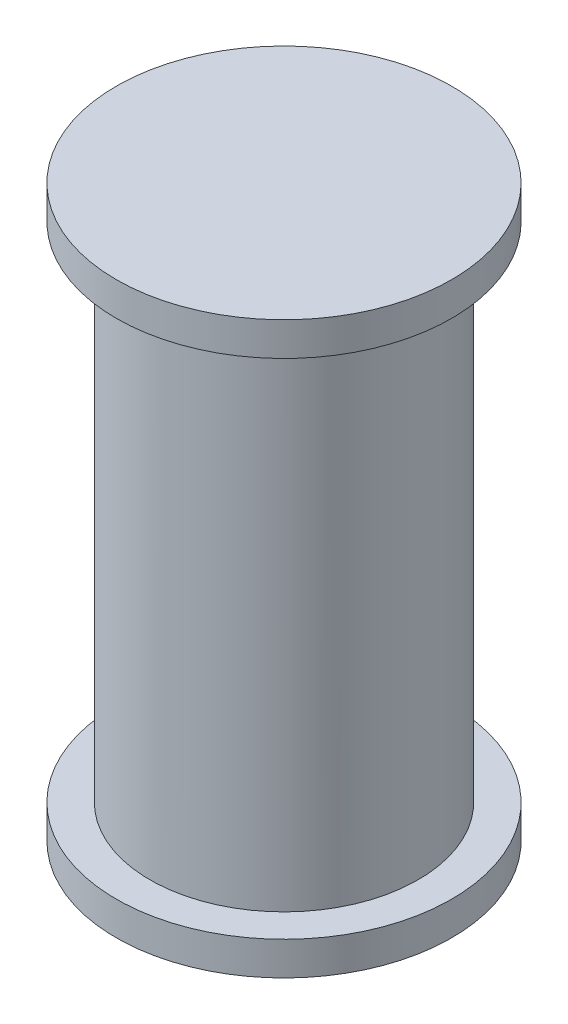
ISO-10303-21;
HEADER;
FILE_DESCRIPTION(('STEP AP214'),'2;1');
FILE_NAME('part.step','',(''),(''),'','','');
FILE_SCHEMA(('AUTOMOTIVE_DESIGN { 1 0 10303 214 1 1 1 1 }'));
ENDSEC;
DATA;
#1=APPLICATION_CONTEXT('core data for automotive mechanical design processes');
#2=APPLICATION_PROTOCOL_DEFINITION('international standard','automotive_design',2000,#1);
#3=PRODUCT_CONTEXT('',#1,'mechanical');
#4=PRODUCT('Part','Part','',(#3));
#5=PRODUCT_RELATED_PRODUCT_CATEGORY('part','',(#4));
#6=PRODUCT_DEFINITION_FORMATION('','',#4);
#7=PRODUCT_DEFINITION_CONTEXT('part definition',#1,'design');
#8=PRODUCT_DEFINITION('design','',#6,#7);
#9=PRODUCT_DEFINITION_SHAPE('','',#8);
#10=(LENGTH_UNIT() NAMED_UNIT(*) SI_UNIT(.MILLI.,.METRE.));
#11=(NAMED_UNIT(*) PLANE_ANGLE_UNIT() SI_UNIT($,.RADIAN.));
#12=(NAMED_UNIT(*) SI_UNIT($,.STERADIAN.) SOLID_ANGLE_UNIT());
#13=UNCERTAINTY_MEASURE_WITH_UNIT(LENGTH_MEASURE(1.E-05),#10,'distance_accuracy_value','');
#14=(GEOMETRIC_REPRESENTATION_CONTEXT(3) GLOBAL_UNCERTAINTY_ASSIGNED_CONTEXT((#13)) GLOBAL_UNIT_ASSIGNED_CONTEXT((#10,
#11,#12)) REPRESENTATION_CONTEXT('',''));
#15=CARTESIAN_POINT('',(0.,0.,0.));
#16=DIRECTION('',(0.,0.,1.));
#17=DIRECTION('',(1.,0.,0.));
#18=AXIS2_PLACEMENT_3D('',#15,#16,#17);
#19=CARTESIAN_POINT('',(0.,15.,0.));
#20=DIRECTION('',(0.,-1.,0.));
#21=DIRECTION('',(0.,0.,-1.));
#22=AXIS2_PLACEMENT_3D('',#19,#20,#21);
#23=CYLINDRICAL_SURFACE('',#22,4.);
#24=CARTESIAN_POINT('',(0.,15.,0.));
#25=DIRECTION('',(0.,1.,0.));
#26=DIRECTION('',(0.,0.,1.));
#27=AXIS2_PLACEMENT_3D('',#24,#25,#26);
#28=CIRCLE('',#27,4.);
#29=CARTESIAN_POINT('',(0.,15.,4.));
#30=VERTEX_POINT('',#29);
#31=EDGE_CURVE('E10',#30,#30,#28,.T.);
#32=ORIENTED_EDGE('',*,*,#31,.F.);
#33=EDGE_LOOP('',(#32));
#34=FACE_BOUND('',#33,.T.);
#35=CARTESIAN_POINT('',(0.,0.,0.));
#36=DIRECTION('',(0.,-1.,0.));
#37=DIRECTION('',(0.,0.,-1.));
#38=AXIS2_PLACEMENT_3D('',#35,#36,#37);
#39=CIRCLE('',#38,4.);
#40=CARTESIAN_POINT('',(0.,0.,-4.));
#41=VERTEX_POINT('',#40);
#42=EDGE_CURVE('E46',#41,#41,#39,.T.);
#43=ORIENTED_EDGE('',*,*,#42,.F.);
#44=EDGE_LOOP('',(#43));
#45=FACE_BOUND('',#44,.T.);
#46=ADVANCED_FACE('F31',(#34,#45),#23,.T.);
#47=CARTESIAN_POINT('',(0.,15.,0.));
#48=DIRECTION('',(0.,1.,0.));
#49=DIRECTION('',(0.,0.,1.));
#50=AXIS2_PLACEMENT_3D('',#47,#48,#49);
#51=PLANE('',#50);
#52=CARTESIAN_POINT('',(0.,15.,0.));
#53=DIRECTION('',(0.,1.,0.));
#54=DIRECTION('',(0.,0.,1.));
#55=AXIS2_PLACEMENT_3D('',#52,#53,#54);
#56=CIRCLE('',#55,5.);
#57=CARTESIAN_POINT('',(0.,15.,5.));
#58=VERTEX_POINT('',#57);
#59=EDGE_CURVE('E41',#58,#58,#56,.T.);
#60=ORIENTED_EDGE('',*,*,#59,.F.);
#61=EDGE_LOOP('',(#60));
#62=FACE_BOUND('',#61,.T.);
#63=ORIENTED_EDGE('',*,*,#31,.T.);
#64=EDGE_LOOP('',(#63));
#65=FACE_BOUND('',#64,.T.);
#66=ADVANCED_FACE('F73',(#62,#65),#51,.F.);
#67=CARTESIAN_POINT('',(0.,16.,0.));
#68=DIRECTION('',(0.,-1.,0.));
#69=DIRECTION('',(0.,0.,-1.));
#70=AXIS2_PLACEMENT_3D('',#67,#68,#69);
#71=CYLINDRICAL_SURFACE('',#70,5.);
#72=CARTESIAN_POINT('',(0.,16.,0.));
#73=DIRECTION('',(0.,1.,0.));
#74=DIRECTION('',(0.,0.,1.));
#75=AXIS2_PLACEMENT_3D('',#72,#73,#74);
#76=CIRCLE('',#75,5.);
#77=CARTESIAN_POINT('',(0.,16.,5.));
#78=VERTEX_POINT('',#77);
#79=EDGE_CURVE('E37',#78,#78,#76,.T.);
#80=ORIENTED_EDGE('',*,*,#79,.F.);
#81=EDGE_LOOP('',(#80));
#82=FACE_BOUND('',#81,.T.);
#83=ORIENTED_EDGE('',*,*,#59,.T.);
#84=EDGE_LOOP('',(#83));
#85=FACE_BOUND('',#84,.T.);
#86=ADVANCED_FACE('F78',(#82,#85),#71,.T.);
#87=CARTESIAN_POINT('',(0.,16.,0.));
#88=DIRECTION('',(0.,1.,0.));
#89=DIRECTION('',(0.,0.,1.));
#90=AXIS2_PLACEMENT_3D('',#87,#88,#89);
#91=PLANE('',#90);
#92=ORIENTED_EDGE('',*,*,#79,.T.);
#93=EDGE_LOOP('',(#92));
#94=FACE_BOUND('',#93,.T.);
#95=ADVANCED_FACE('F68',(#94),#91,.T.);
#96=CARTESIAN_POINT('',(0.,0.,0.));
#97=DIRECTION('',(0.,-1.,0.));
#98=DIRECTION('',(0.,0.,-1.));
#99=AXIS2_PLACEMENT_3D('',#96,#97,#98);
#100=PLANE('',#99);
#101=CARTESIAN_POINT('',(0.,0.,0.));
#102=DIRECTION('',(0.,-1.,0.));
#103=DIRECTION('',(0.,0.,-1.));
#104=AXIS2_PLACEMENT_3D('',#101,#102,#103);
#105=CIRCLE('',#104,5.);
#106=CARTESIAN_POINT('',(0.,0.,-5.));
#107=VERTEX_POINT('',#106);
#108=EDGE_CURVE('E51',#107,#107,#105,.T.);
#109=ORIENTED_EDGE('',*,*,#108,.F.);
#110=EDGE_LOOP('',(#109));
#111=FACE_BOUND('',#110,.T.);
#112=ORIENTED_EDGE('',*,*,#42,.T.);
#113=EDGE_LOOP('',(#112));
#114=FACE_BOUND('',#113,.T.);
#115=ADVANCED_FACE('F62',(#111,#114),#100,.F.);
#116=CARTESIAN_POINT('',(0.,-1.,0.));
#117=DIRECTION('',(0.,1.,0.));
#118=DIRECTION('',(0.,0.,1.));
#119=AXIS2_PLACEMENT_3D('',#116,#117,#118);
#120=CYLINDRICAL_SURFACE('',#119,5.);
#121=CARTESIAN_POINT('',(0.,-1.,0.));
#122=DIRECTION('',(0.,-1.,0.));
#123=DIRECTION('',(0.,0.,-1.));
#124=AXIS2_PLACEMENT_3D('',#121,#122,#123);
#125=CIRCLE('',#124,5.);
#126=CARTESIAN_POINT('',(0.,-1.,-5.));
#127=VERTEX_POINT('',#126);
#128=EDGE_CURVE('E50',#127,#127,#125,.T.);
#129=ORIENTED_EDGE('',*,*,#128,.F.);
#130=EDGE_LOOP('',(#129));
#131=FACE_BOUND('',#130,.T.);
#132=ORIENTED_EDGE('',*,*,#108,.T.);
#133=EDGE_LOOP('',(#132));
#134=FACE_BOUND('',#133,.T.);
#135=ADVANCED_FACE('F59',(#131,#134),#120,.T.);
#136=CARTESIAN_POINT('',(0.,-1.,0.));
#137=DIRECTION('',(0.,-1.,0.));
#138=DIRECTION('',(0.,0.,-1.));
#139=AXIS2_PLACEMENT_3D('',#136,#137,#138);
#140=PLANE('',#139);
#141=ORIENTED_EDGE('',*,*,#128,.T.);
#142=EDGE_LOOP('',(#141));
#143=FACE_BOUND('',#142,.T.);
#144=ADVANCED_FACE('F57',(#143),#140,.T.);
#145=CLOSED_SHELL('',(#46,#66,#86,#95,#115,#135,#144));
#146=MANIFOLD_SOLID_BREP('B2',#145);
#147=ADVANCED_BREP_SHAPE_REPRESENTATION('',(#18,#146),#14);
#148=SHAPE_DEFINITION_REPRESENTATION(#9,#147);
ENDSEC;
END-ISO-10303-21;
